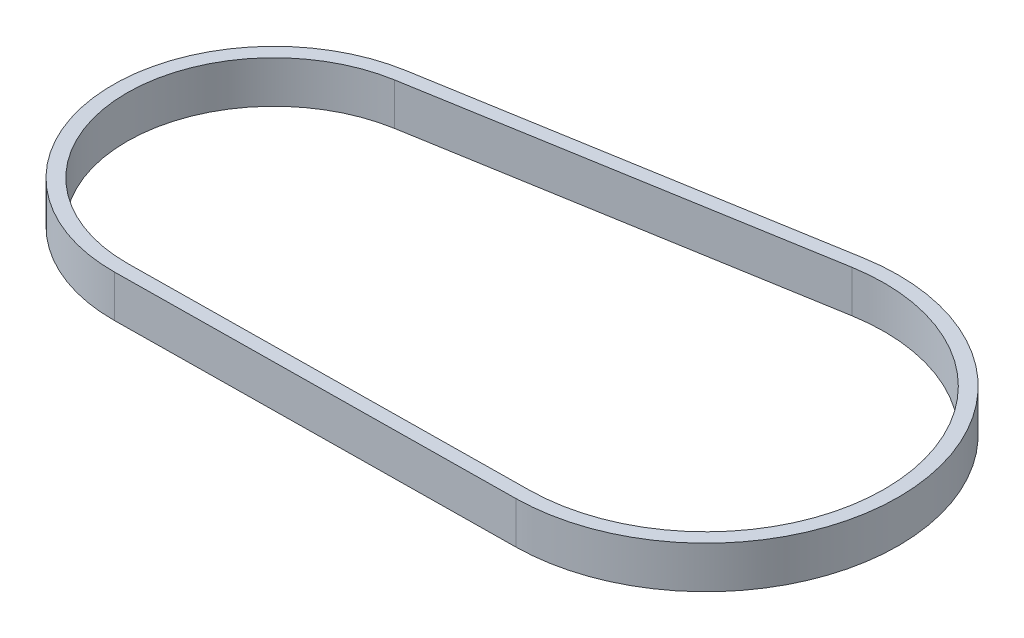
ISO-10303-21;
HEADER;
FILE_DESCRIPTION(('STEP AP214'),'2;1');
FILE_NAME('part.step','',(''),(''),'','','');
FILE_SCHEMA(('AUTOMOTIVE_DESIGN { 1 0 10303 214 1 1 1 1 }'));
ENDSEC;
DATA;
#1=APPLICATION_CONTEXT('core data for automotive mechanical design processes');
#2=APPLICATION_PROTOCOL_DEFINITION('international standard','automotive_design',2000,#1);
#3=PRODUCT_CONTEXT('',#1,'mechanical');
#4=PRODUCT('Part','Part','',(#3));
#5=PRODUCT_RELATED_PRODUCT_CATEGORY('part','',(#4));
#6=PRODUCT_DEFINITION_FORMATION('','',#4);
#7=PRODUCT_DEFINITION_CONTEXT('part definition',#1,'design');
#8=PRODUCT_DEFINITION('design','',#6,#7);
#9=PRODUCT_DEFINITION_SHAPE('','',#8);
#10=(LENGTH_UNIT() NAMED_UNIT(*) SI_UNIT(.MILLI.,.METRE.));
#11=(NAMED_UNIT(*) PLANE_ANGLE_UNIT() SI_UNIT($,.RADIAN.));
#12=(NAMED_UNIT(*) SI_UNIT($,.STERADIAN.) SOLID_ANGLE_UNIT());
#13=UNCERTAINTY_MEASURE_WITH_UNIT(LENGTH_MEASURE(1.E-05),#10,'distance_accuracy_value','');
#14=(GEOMETRIC_REPRESENTATION_CONTEXT(3) GLOBAL_UNCERTAINTY_ASSIGNED_CONTEXT((#13)) GLOBAL_UNIT_ASSIGNED_CONTEXT((#10,
#11,#12)) REPRESENTATION_CONTEXT('',''));
#15=CARTESIAN_POINT('',(0.,0.,0.));
#16=DIRECTION('',(0.,0.,1.));
#17=DIRECTION('',(1.,0.,0.));
#18=AXIS2_PLACEMENT_3D('',#15,#16,#17);
#19=CARTESIAN_POINT('',(0.,6.,0.));
#20=DIRECTION('',(0.,1.,0.));
#21=DIRECTION('',(0.,0.,1.));
#22=AXIS2_PLACEMENT_3D('',#19,#20,#21);
#23=PLANE('',#22);
#24=CARTESIAN_POINT('',(0.,6.,0.));
#25=DIRECTION('',(0.,1.,0.));
#26=DIRECTION('',(0.,0.,1.));
#27=AXIS2_PLACEMENT_3D('',#24,#25,#26);
#28=CIRCLE('',#27,23.02);
#29=CARTESIAN_POINT('',(-3.85685160776903,6.,-22.6946049905181));
#30=VERTEX_POINT('',#29);
#31=CARTESIAN_POINT('',(0.264368031904531,6.,23.018481912231));
#32=VERTEX_POINT('',#31);
#33=EDGE_CURVE('E140',#30,#32,#28,.T.);
#34=ORIENTED_EDGE('',*,*,#33,.T.);
#35=DIRECTION('',(0.999934053528715,0.,-0.0114842759298238));
#36=VECTOR('',#35,1.);
#37=CARTESIAN_POINT('',(0.264368031904531,6.,23.018481912231));
#38=LINE('',#37,#36);
#39=CARTESIAN_POINT('',(56.88531489974,6.,22.3681884504338));
#40=VERTEX_POINT('',#39);
#41=EDGE_CURVE('E143',#32,#40,#38,.T.);
#42=ORIENTED_EDGE('',*,*,#41,.T.);
#43=CARTESIAN_POINT('',(56.5698418399478,6.,-5.1));
#44=DIRECTION('',(0.,1.,0.));
#45=DIRECTION('',(0.,0.,1.));
#46=AXIS2_PLACEMENT_3D('',#43,#44,#45);
#47=CIRCLE('',#46,27.47);
#48=CARTESIAN_POINT('',(51.9674216112156,6.,-32.181702827521));
#49=VERTEX_POINT('',#48);
#50=EDGE_CURVE('E146',#40,#49,#47,.T.);
#51=ORIENTED_EDGE('',*,*,#50,.T.);
#52=DIRECTION('',(-0.98586468247255,0.,0.167543510328802));
#53=VECTOR('',#52,1.);
#54=CARTESIAN_POINT('',(-3.85685160776903,6.,-22.6946049905181));
#55=LINE('',#54,#53);
#56=EDGE_CURVE('E148',#49,#30,#55,.T.);
#57=ORIENTED_EDGE('',*,*,#56,.T.);
#58=EDGE_LOOP('',(#34,#42,#51,#57));
#59=FACE_BOUND('',#58,.T.);
#60=DIRECTION('',(0.999934053528715,0.,-0.0114842759298238));
#61=VECTOR('',#60,1.);
#62=CARTESIAN_POINT('',(0.241399480044883,6.,21.0186138051736));
#63=LINE('',#62,#61);
#64=CARTESIAN_POINT('',(0.241399480044883,6.,21.0186138051736));
#65=VERTEX_POINT('',#64);
#66=CARTESIAN_POINT('',(56.8623463478804,6.,20.3683203433764));
#67=VERTEX_POINT('',#66);
#68=EDGE_CURVE('E112',#65,#67,#63,.T.);
#69=ORIENTED_EDGE('',*,*,#68,.F.);
#70=CARTESIAN_POINT('',(0.,6.,0.));
#71=DIRECTION('',(0.,1.,0.));
#72=DIRECTION('',(0.,0.,1.));
#73=AXIS2_PLACEMENT_3D('',#70,#71,#72);
#74=CIRCLE('',#73,21.02);
#75=CARTESIAN_POINT('',(-3.52176458711143,6.,-20.722875625573));
#76=VERTEX_POINT('',#75);
#77=EDGE_CURVE('E104',#76,#65,#74,.T.);
#78=ORIENTED_EDGE('',*,*,#77,.F.);
#79=DIRECTION('',(-0.98586468247255,0.,0.167543510328802));
#80=VECTOR('',#79,1.);
#81=CARTESIAN_POINT('',(-3.52176458711143,6.,-20.722875625573));
#82=LINE('',#81,#80);
#83=CARTESIAN_POINT('',(52.3025086318732,6.,-30.2099734625759));
#84=VERTEX_POINT('',#83);
#85=EDGE_CURVE('E126',#84,#76,#82,.T.);
#86=ORIENTED_EDGE('',*,*,#85,.F.);
#87=CARTESIAN_POINT('',(56.5698418399478,6.,-5.1));
#88=DIRECTION('',(0.,1.,0.));
#89=DIRECTION('',(0.,0.,1.));
#90=AXIS2_PLACEMENT_3D('',#87,#88,#89);
#91=CIRCLE('',#90,25.47);
#92=EDGE_CURVE('E124',#67,#84,#91,.T.);
#93=ORIENTED_EDGE('',*,*,#92,.F.);
#94=EDGE_LOOP('',(#69,#78,#86,#93));
#95=FACE_BOUND('',#94,.T.);
#96=ADVANCED_FACE('F39',(#59,#95),#23,.T.);
#97=CARTESIAN_POINT('',(0.,0.,0.));
#98=DIRECTION('',(0.,1.,0.));
#99=DIRECTION('',(0.,0.,1.));
#100=AXIS2_PLACEMENT_3D('',#97,#98,#99);
#101=PLANE('',#100);
#102=CARTESIAN_POINT('',(0.,0.,0.));
#103=DIRECTION('',(0.,1.,0.));
#104=DIRECTION('',(0.,0.,1.));
#105=AXIS2_PLACEMENT_3D('',#102,#103,#104);
#106=CIRCLE('',#105,23.02);
#107=CARTESIAN_POINT('',(-3.85685160776903,0.,-22.6946049905181));
#108=VERTEX_POINT('',#107);
#109=CARTESIAN_POINT('',(0.264368031904531,0.,23.018481912231));
#110=VERTEX_POINT('',#109);
#111=EDGE_CURVE('E120',#108,#110,#106,.T.);
#112=ORIENTED_EDGE('',*,*,#111,.F.);
#113=DIRECTION('',(-0.98586468247255,0.,0.167543510328802));
#114=VECTOR('',#113,1.);
#115=CARTESIAN_POINT('',(-3.85685160776903,0.,-22.6946049905181));
#116=LINE('',#115,#114);
#117=CARTESIAN_POINT('',(51.9674216112156,0.,-32.181702827521));
#118=VERTEX_POINT('',#117);
#119=EDGE_CURVE('E144',#118,#108,#116,.T.);
#120=ORIENTED_EDGE('',*,*,#119,.F.);
#121=CARTESIAN_POINT('',(56.5698418399478,0.,-5.1));
#122=DIRECTION('',(0.,1.,0.));
#123=DIRECTION('',(0.,0.,1.));
#124=AXIS2_PLACEMENT_3D('',#121,#122,#123);
#125=CIRCLE('',#124,27.47);
#126=CARTESIAN_POINT('',(56.88531489974,0.,22.3681884504338));
#127=VERTEX_POINT('',#126);
#128=EDGE_CURVE('E155',#127,#118,#125,.T.);
#129=ORIENTED_EDGE('',*,*,#128,.F.);
#130=DIRECTION('',(0.999934053528715,0.,-0.0114842759298238));
#131=VECTOR('',#130,1.);
#132=CARTESIAN_POINT('',(0.264368031904531,0.,23.018481912231));
#133=LINE('',#132,#131);
#134=EDGE_CURVE('E153',#110,#127,#133,.T.);
#135=ORIENTED_EDGE('',*,*,#134,.F.);
#136=EDGE_LOOP('',(#112,#120,#129,#135));
#137=FACE_BOUND('',#136,.T.);
#138=CARTESIAN_POINT('',(0.,0.,0.));
#139=DIRECTION('',(0.,1.,0.));
#140=DIRECTION('',(0.,0.,1.));
#141=AXIS2_PLACEMENT_3D('',#138,#139,#140);
#142=CIRCLE('',#141,21.02);
#143=CARTESIAN_POINT('',(-3.52176458711143,0.,-20.722875625573));
#144=VERTEX_POINT('',#143);
#145=CARTESIAN_POINT('',(0.241399480044883,0.,21.0186138051736));
#146=VERTEX_POINT('',#145);
#147=EDGE_CURVE('E62',#144,#146,#142,.T.);
#148=ORIENTED_EDGE('',*,*,#147,.T.);
#149=DIRECTION('',(0.999934053528715,0.,-0.0114842759298238));
#150=VECTOR('',#149,1.);
#151=CARTESIAN_POINT('',(0.241399480044883,0.,21.0186138051736));
#152=LINE('',#151,#150);
#153=CARTESIAN_POINT('',(56.8623463478804,0.,20.3683203433764));
#154=VERTEX_POINT('',#153);
#155=EDGE_CURVE('E119',#146,#154,#152,.T.);
#156=ORIENTED_EDGE('',*,*,#155,.T.);
#157=CARTESIAN_POINT('',(56.5698418399478,0.,-5.1));
#158=DIRECTION('',(0.,1.,0.));
#159=DIRECTION('',(0.,0.,1.));
#160=AXIS2_PLACEMENT_3D('',#157,#158,#159);
#161=CIRCLE('',#160,25.47);
#162=CARTESIAN_POINT('',(52.3025086318732,0.,-30.2099734625759));
#163=VERTEX_POINT('',#162);
#164=EDGE_CURVE('E132',#154,#163,#161,.T.);
#165=ORIENTED_EDGE('',*,*,#164,.T.);
#166=DIRECTION('',(-0.98586468247255,0.,0.167543510328802));
#167=VECTOR('',#166,1.);
#168=CARTESIAN_POINT('',(-3.52176458711143,0.,-20.722875625573));
#169=LINE('',#168,#167);
#170=EDGE_CURVE('E113',#163,#144,#169,.T.);
#171=ORIENTED_EDGE('',*,*,#170,.T.);
#172=EDGE_LOOP('',(#148,#156,#165,#171));
#173=FACE_BOUND('',#172,.T.);
#174=ADVANCED_FACE('F173',(#137,#173),#101,.F.);
#175=CARTESIAN_POINT('',(0.,6.,0.));
#176=DIRECTION('',(0.,-1.,0.));
#177=DIRECTION('',(0.,0.,-1.));
#178=AXIS2_PLACEMENT_3D('',#175,#176,#177);
#179=CYLINDRICAL_SURFACE('',#178,23.02);
#180=ORIENTED_EDGE('',*,*,#111,.T.);
#181=DIRECTION('',(0.,-1.,0.));
#182=VECTOR('',#181,1.);
#183=CARTESIAN_POINT('',(0.264368031904531,6.,23.018481912231));
#184=LINE('',#183,#182);
#185=EDGE_CURVE('E11',#32,#110,#184,.T.);
#186=ORIENTED_EDGE('',*,*,#185,.F.);
#187=ORIENTED_EDGE('',*,*,#33,.F.);
#188=DIRECTION('',(0.,-1.,0.));
#189=VECTOR('',#188,1.);
#190=CARTESIAN_POINT('',(-3.85685160776903,6.,-22.6946049905181));
#191=LINE('',#190,#189);
#192=EDGE_CURVE('E150',#30,#108,#191,.T.);
#193=ORIENTED_EDGE('',*,*,#192,.T.);
#194=EDGE_LOOP('',(#180,#186,#187,#193));
#195=FACE_BOUND('',#194,.T.);
#196=ADVANCED_FACE('F41',(#195),#179,.T.);
#197=CARTESIAN_POINT('',(0.264368031904531,6.,23.018481912231));
#198=DIRECTION('',(-0.0114842759298238,0.,-0.999934053528715));
#199=DIRECTION('',(-0.999934053528715,0.,0.0114842759298238));
#200=AXIS2_PLACEMENT_3D('',#197,#198,#199);
#201=PLANE('',#200);
#202=ORIENTED_EDGE('',*,*,#134,.T.);
#203=DIRECTION('',(0.,-1.,0.));
#204=VECTOR('',#203,1.);
#205=CARTESIAN_POINT('',(56.88531489974,6.,22.3681884504338));
#206=LINE('',#205,#204);
#207=EDGE_CURVE('E47',#40,#127,#206,.T.);
#208=ORIENTED_EDGE('',*,*,#207,.F.);
#209=ORIENTED_EDGE('',*,*,#41,.F.);
#210=ORIENTED_EDGE('',*,*,#185,.T.);
#211=EDGE_LOOP('',(#202,#208,#209,#210));
#212=FACE_BOUND('',#211,.T.);
#213=ADVANCED_FACE('F183',(#212),#201,.F.);
#214=CARTESIAN_POINT('',(56.5698418399478,6.,-5.1));
#215=DIRECTION('',(0.,-1.,0.));
#216=DIRECTION('',(0.,0.,-1.));
#217=AXIS2_PLACEMENT_3D('',#214,#215,#216);
#218=CYLINDRICAL_SURFACE('',#217,27.47);
#219=ORIENTED_EDGE('',*,*,#128,.T.);
#220=DIRECTION('',(0.,-1.,0.));
#221=VECTOR('',#220,1.);
#222=CARTESIAN_POINT('',(51.9674216112156,6.,-32.181702827521));
#223=LINE('',#222,#221);
#224=EDGE_CURVE('E160',#49,#118,#223,.T.);
#225=ORIENTED_EDGE('',*,*,#224,.F.);
#226=ORIENTED_EDGE('',*,*,#50,.F.);
#227=ORIENTED_EDGE('',*,*,#207,.T.);
#228=EDGE_LOOP('',(#219,#225,#226,#227));
#229=FACE_BOUND('',#228,.T.);
#230=ADVANCED_FACE('F167',(#229),#218,.T.);
#231=CARTESIAN_POINT('',(-3.85685160776903,6.,-22.6946049905181));
#232=DIRECTION('',(0.167543510328802,0.,0.98586468247255));
#233=DIRECTION('',(0.98586468247255,0.,-0.167543510328802));
#234=AXIS2_PLACEMENT_3D('',#231,#232,#233);
#235=PLANE('',#234);
#236=ORIENTED_EDGE('',*,*,#119,.T.);
#237=ORIENTED_EDGE('',*,*,#192,.F.);
#238=ORIENTED_EDGE('',*,*,#56,.F.);
#239=ORIENTED_EDGE('',*,*,#224,.T.);
#240=EDGE_LOOP('',(#236,#237,#238,#239));
#241=FACE_BOUND('',#240,.T.);
#242=ADVANCED_FACE('F177',(#241),#235,.F.);
#243=CARTESIAN_POINT('',(0.,6.,0.));
#244=DIRECTION('',(0.,-1.,0.));
#245=DIRECTION('',(0.,0.,-1.));
#246=AXIS2_PLACEMENT_3D('',#243,#244,#245);
#247=CYLINDRICAL_SURFACE('',#246,21.02);
#248=ORIENTED_EDGE('',*,*,#147,.F.);
#249=DIRECTION('',(0.,-1.,0.));
#250=VECTOR('',#249,1.);
#251=CARTESIAN_POINT('',(-3.52176458711143,6.,-20.722875625573));
#252=LINE('',#251,#250);
#253=EDGE_CURVE('E108',#76,#144,#252,.T.);
#254=ORIENTED_EDGE('',*,*,#253,.F.);
#255=ORIENTED_EDGE('',*,*,#77,.T.);
#256=DIRECTION('',(0.,-1.,0.));
#257=VECTOR('',#256,1.);
#258=CARTESIAN_POINT('',(0.241399480044883,6.,21.0186138051736));
#259=LINE('',#258,#257);
#260=EDGE_CURVE('E107',#65,#146,#259,.T.);
#261=ORIENTED_EDGE('',*,*,#260,.T.);
#262=EDGE_LOOP('',(#248,#254,#255,#261));
#263=FACE_BOUND('',#262,.T.);
#264=ADVANCED_FACE('F106',(#263),#247,.F.);
#265=CARTESIAN_POINT('',(0.241399480044883,6.,21.0186138051736));
#266=DIRECTION('',(-0.0114842759298238,0.,-0.999934053528715));
#267=DIRECTION('',(-0.999934053528715,0.,0.0114842759298238));
#268=AXIS2_PLACEMENT_3D('',#265,#266,#267);
#269=PLANE('',#268);
#270=ORIENTED_EDGE('',*,*,#155,.F.);
#271=ORIENTED_EDGE('',*,*,#260,.F.);
#272=ORIENTED_EDGE('',*,*,#68,.T.);
#273=DIRECTION('',(0.,-1.,0.));
#274=VECTOR('',#273,1.);
#275=CARTESIAN_POINT('',(56.8623463478804,6.,20.3683203433764));
#276=LINE('',#275,#274);
#277=EDGE_CURVE('E121',#67,#154,#276,.T.);
#278=ORIENTED_EDGE('',*,*,#277,.T.);
#279=EDGE_LOOP('',(#270,#271,#272,#278));
#280=FACE_BOUND('',#279,.T.);
#281=ADVANCED_FACE('F116',(#280),#269,.T.);
#282=CARTESIAN_POINT('',(56.5698418399478,6.,-5.1));
#283=DIRECTION('',(0.,-1.,0.));
#284=DIRECTION('',(0.,0.,-1.));
#285=AXIS2_PLACEMENT_3D('',#282,#283,#284);
#286=CYLINDRICAL_SURFACE('',#285,25.47);
#287=ORIENTED_EDGE('',*,*,#164,.F.);
#288=ORIENTED_EDGE('',*,*,#277,.F.);
#289=ORIENTED_EDGE('',*,*,#92,.T.);
#290=DIRECTION('',(0.,-1.,0.));
#291=VECTOR('',#290,1.);
#292=CARTESIAN_POINT('',(52.3025086318732,6.,-30.2099734625759));
#293=LINE('',#292,#291);
#294=EDGE_CURVE('E54',#84,#163,#293,.T.);
#295=ORIENTED_EDGE('',*,*,#294,.T.);
#296=EDGE_LOOP('',(#287,#288,#289,#295));
#297=FACE_BOUND('',#296,.T.);
#298=ADVANCED_FACE('F206',(#297),#286,.F.);
#299=CARTESIAN_POINT('',(-3.52176458711143,6.,-20.722875625573));
#300=DIRECTION('',(0.167543510328802,0.,0.98586468247255));
#301=DIRECTION('',(0.98586468247255,0.,-0.167543510328802));
#302=AXIS2_PLACEMENT_3D('',#299,#300,#301);
#303=PLANE('',#302);
#304=ORIENTED_EDGE('',*,*,#170,.F.);
#305=ORIENTED_EDGE('',*,*,#294,.F.);
#306=ORIENTED_EDGE('',*,*,#85,.T.);
#307=ORIENTED_EDGE('',*,*,#253,.T.);
#308=EDGE_LOOP('',(#304,#305,#306,#307));
#309=FACE_BOUND('',#308,.T.);
#310=ADVANCED_FACE('F210',(#309),#303,.T.);
#311=CLOSED_SHELL('',(#96,#174,#196,#213,#230,#242,#264,#281,#298,#310));
#312=MANIFOLD_SOLID_BREP('B2',#311);
#313=ADVANCED_BREP_SHAPE_REPRESENTATION('',(#18,#312),#14);
#314=SHAPE_DEFINITION_REPRESENTATION(#9,#313);
ENDSEC;
END-ISO-10303-21;
